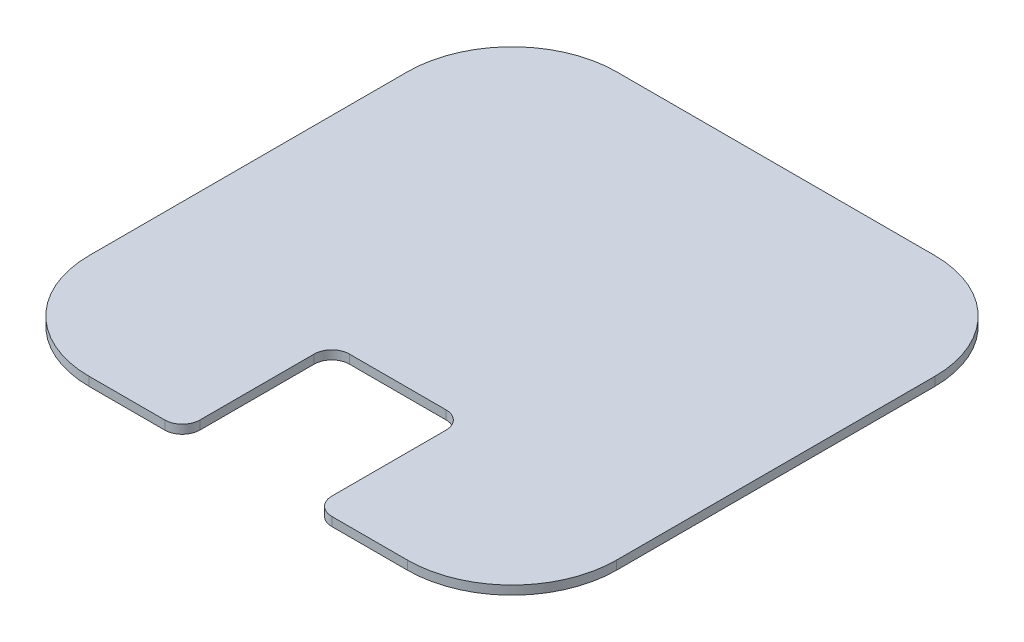
ISO-10303-21;
HEADER;
FILE_DESCRIPTION(('STEP AP214'),'2;1');
FILE_NAME('part.step','',(''),(''),'','','');
FILE_SCHEMA(('AUTOMOTIVE_DESIGN { 1 0 10303 214 1 1 1 1 }'));
ENDSEC;
DATA;
#1=APPLICATION_CONTEXT('core data for automotive mechanical design processes');
#2=APPLICATION_PROTOCOL_DEFINITION('international standard','automotive_design',2000,#1);
#3=PRODUCT_CONTEXT('',#1,'mechanical');
#4=PRODUCT('Part','Part','',(#3));
#5=PRODUCT_RELATED_PRODUCT_CATEGORY('part','',(#4));
#6=PRODUCT_DEFINITION_FORMATION('','',#4);
#7=PRODUCT_DEFINITION_CONTEXT('part definition',#1,'design');
#8=PRODUCT_DEFINITION('design','',#6,#7);
#9=PRODUCT_DEFINITION_SHAPE('','',#8);
#10=(LENGTH_UNIT() NAMED_UNIT(*) SI_UNIT(.MILLI.,.METRE.));
#11=(NAMED_UNIT(*) PLANE_ANGLE_UNIT() SI_UNIT($,.RADIAN.));
#12=(NAMED_UNIT(*) SI_UNIT($,.STERADIAN.) SOLID_ANGLE_UNIT());
#13=UNCERTAINTY_MEASURE_WITH_UNIT(LENGTH_MEASURE(1.E-05),#10,'distance_accuracy_value','');
#14=(GEOMETRIC_REPRESENTATION_CONTEXT(3) GLOBAL_UNCERTAINTY_ASSIGNED_CONTEXT((#13)) GLOBAL_UNIT_ASSIGNED_CONTEXT((#10,
#11,#12)) REPRESENTATION_CONTEXT('',''));
#15=CARTESIAN_POINT('',(0.,0.,0.));
#16=DIRECTION('',(0.,0.,1.));
#17=DIRECTION('',(1.,0.,0.));
#18=AXIS2_PLACEMENT_3D('',#15,#16,#17);
#19=CARTESIAN_POINT('',(-18.1066017177982,1.,30.));
#20=DIRECTION('',(0.,0.,-1.));
#21=DIRECTION('',(-1.,0.,0.));
#22=AXIS2_PLACEMENT_3D('',#19,#20,#21);
#23=PLANE('',#22);
#24=DIRECTION('',(1.,0.,0.));
#25=VECTOR('',#24,1.);
#26=CARTESIAN_POINT('',(-18.1066017177982,0.,30.));
#27=LINE('',#26,#25);
#28=CARTESIAN_POINT('',(-18.1066017177982,0.,30.));
#29=VERTEX_POINT('',#28);
#30=CARTESIAN_POINT('',(-9.5,0.,30.));
#31=VERTEX_POINT('',#30);
#32=EDGE_CURVE('E263',#29,#31,#27,.T.);
#33=ORIENTED_EDGE('',*,*,#32,.T.);
#34=DIRECTION('',(0.,-1.,0.));
#35=VECTOR('',#34,1.);
#36=CARTESIAN_POINT('',(-9.5,1.,30.));
#37=LINE('',#36,#35);
#38=CARTESIAN_POINT('',(-9.5,1.,30.));
#39=VERTEX_POINT('',#38);
#40=EDGE_CURVE('E48',#31,#39,#37,.F.);
#41=ORIENTED_EDGE('',*,*,#40,.T.);
#42=DIRECTION('',(1.,0.,0.));
#43=VECTOR('',#42,1.);
#44=CARTESIAN_POINT('',(-18.1066017177982,1.,30.));
#45=LINE('',#44,#43);
#46=CARTESIAN_POINT('',(-18.1066017177982,1.,30.));
#47=VERTEX_POINT('',#46);
#48=EDGE_CURVE('E249',#47,#39,#45,.T.);
#49=ORIENTED_EDGE('',*,*,#48,.F.);
#50=DIRECTION('',(0.,-1.,0.));
#51=VECTOR('',#50,1.);
#52=CARTESIAN_POINT('',(-18.1066017177982,1.,30.));
#53=LINE('',#52,#51);
#54=EDGE_CURVE('E275',#47,#29,#53,.T.);
#55=ORIENTED_EDGE('',*,*,#54,.T.);
#56=EDGE_LOOP('',(#33,#41,#49,#55));
#57=FACE_BOUND('',#56,.T.);
#58=ADVANCED_FACE('F33',(#57),#23,.F.);
#59=CARTESIAN_POINT('',(9.50000000000001,1.,30.));
#60=VERTEX_POINT('',#59);
#61=CARTESIAN_POINT('',(18.1066017177982,1.,30.));
#62=VERTEX_POINT('',#61);
#63=EDGE_CURVE('E248',#60,#62,#45,.T.);
#64=ORIENTED_EDGE('',*,*,#63,.F.);
#65=DIRECTION('',(0.,-1.,0.));
#66=VECTOR('',#65,1.);
#67=CARTESIAN_POINT('',(9.50000000000001,0.,30.));
#68=LINE('',#67,#66);
#69=CARTESIAN_POINT('',(9.50000000000001,0.,30.));
#70=VERTEX_POINT('',#69);
#71=EDGE_CURVE('E173',#60,#70,#68,.T.);
#72=ORIENTED_EDGE('',*,*,#71,.T.);
#73=CARTESIAN_POINT('',(18.1066017177982,0.,30.));
#74=VERTEX_POINT('',#73);
#75=EDGE_CURVE('E262',#70,#74,#27,.T.);
#76=ORIENTED_EDGE('',*,*,#75,.T.);
#77=DIRECTION('',(0.,-1.,0.));
#78=VECTOR('',#77,1.);
#79=CARTESIAN_POINT('',(18.1066017177982,1.,30.));
#80=LINE('',#79,#78);
#81=EDGE_CURVE('E272',#62,#74,#80,.T.);
#82=ORIENTED_EDGE('',*,*,#81,.F.);
#83=EDGE_LOOP('',(#64,#72,#76,#82));
#84=FACE_BOUND('',#83,.T.);
#85=ADVANCED_FACE('F310',(#84),#23,.F.);
#86=CARTESIAN_POINT('',(18.1066017177982,1.,-18.1066017177982));
#87=DIRECTION('',(0.,-1.,0.));
#88=DIRECTION('',(0.,0.,-1.));
#89=AXIS2_PLACEMENT_3D('',#86,#87,#88);
#90=PLANE('',#89);
#91=DIRECTION('',(0.,0.,-1.));
#92=VECTOR('',#91,1.);
#93=CARTESIAN_POINT('',(7.5,1.,30.));
#94=LINE('',#93,#92);
#95=CARTESIAN_POINT('',(7.5,1.,28.));
#96=VERTEX_POINT('',#95);
#97=CARTESIAN_POINT('',(7.5,1.,15.));
#98=VERTEX_POINT('',#97);
#99=EDGE_CURVE('E231',#96,#98,#94,.T.);
#100=ORIENTED_EDGE('',*,*,#99,.F.);
#101=CARTESIAN_POINT('',(9.50000000000001,1.,28.));
#102=DIRECTION('',(0.,-1.,0.));
#103=DIRECTION('',(0.,0.,-1.));
#104=AXIS2_PLACEMENT_3D('',#101,#102,#103);
#105=CIRCLE('',#104,2.);
#106=EDGE_CURVE('E192',#96,#60,#105,.F.);
#107=ORIENTED_EDGE('',*,*,#106,.T.);
#108=ORIENTED_EDGE('',*,*,#63,.T.);
#109=CARTESIAN_POINT('',(18.1066017177982,1.,18.1066017177982));
#110=DIRECTION('',(0.,1.,0.));
#111=DIRECTION('',(0.,0.,-1.));
#112=AXIS2_PLACEMENT_3D('',#109,#110,#111);
#113=CIRCLE('',#112,11.8933982822018);
#114=CARTESIAN_POINT('',(30.,1.,18.1066017177982));
#115=VERTEX_POINT('',#114);
#116=EDGE_CURVE('E251',#62,#115,#113,.T.);
#117=ORIENTED_EDGE('',*,*,#116,.T.);
#118=DIRECTION('',(0.,0.,-1.));
#119=VECTOR('',#118,1.);
#120=CARTESIAN_POINT('',(30.,1.,18.1066017177982));
#121=LINE('',#120,#119);
#122=CARTESIAN_POINT('',(30.,1.,-18.1066017177982));
#123=VERTEX_POINT('',#122);
#124=EDGE_CURVE('E164',#115,#123,#121,.T.);
#125=ORIENTED_EDGE('',*,*,#124,.T.);
#126=CARTESIAN_POINT('',(18.1066017177982,1.,-18.1066017177982));
#127=DIRECTION('',(0.,1.,0.));
#128=DIRECTION('',(0.,0.,-1.));
#129=AXIS2_PLACEMENT_3D('',#126,#127,#128);
#130=CIRCLE('',#129,11.8933982822018);
#131=CARTESIAN_POINT('',(18.1066017177982,1.,-30.));
#132=VERTEX_POINT('',#131);
#133=EDGE_CURVE('E158',#123,#132,#130,.T.);
#134=ORIENTED_EDGE('',*,*,#133,.T.);
#135=DIRECTION('',(-1.,0.,0.));
#136=VECTOR('',#135,1.);
#137=CARTESIAN_POINT('',(-18.1066017177983,1.,-30.));
#138=LINE('',#137,#136);
#139=CARTESIAN_POINT('',(-18.1066017177983,1.,-30.));
#140=VERTEX_POINT('',#139);
#141=EDGE_CURVE('E148',#132,#140,#138,.T.);
#142=ORIENTED_EDGE('',*,*,#141,.T.);
#143=CARTESIAN_POINT('',(-18.1066017177982,1.,-18.1066017177982));
#144=DIRECTION('',(0.,1.,0.));
#145=DIRECTION('',(0.,0.,-1.));
#146=AXIS2_PLACEMENT_3D('',#143,#144,#145);
#147=CIRCLE('',#146,11.8933982822017);
#148=CARTESIAN_POINT('',(-30.,1.,-18.1066017177982));
#149=VERTEX_POINT('',#148);
#150=EDGE_CURVE('E157',#140,#149,#147,.T.);
#151=ORIENTED_EDGE('',*,*,#150,.T.);
#152=DIRECTION('',(0.,0.,1.));
#153=VECTOR('',#152,1.);
#154=CARTESIAN_POINT('',(-30.,1.,18.1066017177982));
#155=LINE('',#154,#153);
#156=CARTESIAN_POINT('',(-30.,1.,18.1066017177982));
#157=VERTEX_POINT('',#156);
#158=EDGE_CURVE('E244',#149,#157,#155,.T.);
#159=ORIENTED_EDGE('',*,*,#158,.T.);
#160=CARTESIAN_POINT('',(-18.1066017177982,1.,18.1066017177982));
#161=DIRECTION('',(0.,1.,0.));
#162=DIRECTION('',(0.,0.,-1.));
#163=AXIS2_PLACEMENT_3D('',#160,#161,#162);
#164=CIRCLE('',#163,11.8933982822018);
#165=EDGE_CURVE('E246',#157,#47,#164,.T.);
#166=ORIENTED_EDGE('',*,*,#165,.T.);
#167=ORIENTED_EDGE('',*,*,#48,.T.);
#168=CARTESIAN_POINT('',(-9.5,1.,28.));
#169=DIRECTION('',(0.,-1.,0.));
#170=DIRECTION('',(0.,0.,-1.));
#171=AXIS2_PLACEMENT_3D('',#168,#169,#170);
#172=CIRCLE('',#171,2.);
#173=CARTESIAN_POINT('',(-7.5,1.,28.));
#174=VERTEX_POINT('',#173);
#175=EDGE_CURVE('E190',#39,#174,#172,.F.);
#176=ORIENTED_EDGE('',*,*,#175,.T.);
#177=DIRECTION('',(0.,0.,1.));
#178=VECTOR('',#177,1.);
#179=CARTESIAN_POINT('',(-7.5,1.,30.));
#180=LINE('',#179,#178);
#181=CARTESIAN_POINT('',(-7.5,1.,15.));
#182=VERTEX_POINT('',#181);
#183=EDGE_CURVE('E236',#182,#174,#180,.T.);
#184=ORIENTED_EDGE('',*,*,#183,.F.);
#185=CARTESIAN_POINT('',(-5.5,1.,15.));
#186=DIRECTION('',(0.,-1.,0.));
#187=DIRECTION('',(0.,0.,-1.));
#188=AXIS2_PLACEMENT_3D('',#185,#186,#187);
#189=CIRCLE('',#188,2.);
#190=CARTESIAN_POINT('',(-5.5,1.,13.));
#191=VERTEX_POINT('',#190);
#192=EDGE_CURVE('E11',#182,#191,#189,.T.);
#193=ORIENTED_EDGE('',*,*,#192,.T.);
#194=DIRECTION('',(-1.,0.,0.));
#195=VECTOR('',#194,1.);
#196=CARTESIAN_POINT('',(-7.5,1.,13.));
#197=LINE('',#196,#195);
#198=CARTESIAN_POINT('',(5.5,1.,13.));
#199=VERTEX_POINT('',#198);
#200=EDGE_CURVE('E229',#199,#191,#197,.T.);
#201=ORIENTED_EDGE('',*,*,#200,.F.);
#202=CARTESIAN_POINT('',(5.5,1.,15.));
#203=DIRECTION('',(0.,-1.,0.));
#204=DIRECTION('',(0.,0.,-1.));
#205=AXIS2_PLACEMENT_3D('',#202,#203,#204);
#206=CIRCLE('',#205,2.);
#207=EDGE_CURVE('E207',#199,#98,#206,.T.);
#208=ORIENTED_EDGE('',*,*,#207,.T.);
#209=EDGE_LOOP('',(#100,#107,#108,#117,#125,#134,#142,#151,#159,#166,#167,#176,#184,#193,#201,#208));
#210=FACE_BOUND('',#209,.T.);
#211=ADVANCED_FACE('F162',(#210),#90,.F.);
#212=CARTESIAN_POINT('',(18.1066017177982,0.,-18.1066017177982));
#213=DIRECTION('',(0.,-1.,0.));
#214=DIRECTION('',(0.,0.,-1.));
#215=AXIS2_PLACEMENT_3D('',#212,#213,#214);
#216=PLANE('',#215);
#217=ORIENTED_EDGE('',*,*,#75,.F.);
#218=CARTESIAN_POINT('',(9.50000000000001,0.,28.));
#219=DIRECTION('',(0.,-1.,0.));
#220=DIRECTION('',(0.,0.,-1.));
#221=AXIS2_PLACEMENT_3D('',#218,#219,#220);
#222=CIRCLE('',#221,2.);
#223=CARTESIAN_POINT('',(7.5,0.,28.));
#224=VERTEX_POINT('',#223);
#225=EDGE_CURVE('E183',#70,#224,#222,.T.);
#226=ORIENTED_EDGE('',*,*,#225,.T.);
#227=DIRECTION('',(0.,0.,-1.));
#228=VECTOR('',#227,1.);
#229=CARTESIAN_POINT('',(7.5,0.,30.));
#230=LINE('',#229,#228);
#231=CARTESIAN_POINT('',(7.5,0.,15.));
#232=VERTEX_POINT('',#231);
#233=EDGE_CURVE('E224',#224,#232,#230,.T.);
#234=ORIENTED_EDGE('',*,*,#233,.T.);
#235=CARTESIAN_POINT('',(5.5,0.,15.));
#236=DIRECTION('',(0.,-1.,0.));
#237=DIRECTION('',(0.,0.,-1.));
#238=AXIS2_PLACEMENT_3D('',#235,#236,#237);
#239=CIRCLE('',#238,2.);
#240=CARTESIAN_POINT('',(5.5,0.,13.));
#241=VERTEX_POINT('',#240);
#242=EDGE_CURVE('E205',#232,#241,#239,.F.);
#243=ORIENTED_EDGE('',*,*,#242,.T.);
#244=DIRECTION('',(-1.,0.,0.));
#245=VECTOR('',#244,1.);
#246=CARTESIAN_POINT('',(-7.5,0.,13.));
#247=LINE('',#246,#245);
#248=CARTESIAN_POINT('',(-5.5,0.,13.));
#249=VERTEX_POINT('',#248);
#250=EDGE_CURVE('E216',#241,#249,#247,.T.);
#251=ORIENTED_EDGE('',*,*,#250,.T.);
#252=CARTESIAN_POINT('',(-5.5,0.,15.));
#253=DIRECTION('',(0.,-1.,0.));
#254=DIRECTION('',(0.,0.,-1.));
#255=AXIS2_PLACEMENT_3D('',#252,#253,#254);
#256=CIRCLE('',#255,2.);
#257=CARTESIAN_POINT('',(-7.5,0.,15.));
#258=VERTEX_POINT('',#257);
#259=EDGE_CURVE('E41',#249,#258,#256,.F.);
#260=ORIENTED_EDGE('',*,*,#259,.T.);
#261=DIRECTION('',(0.,0.,1.));
#262=VECTOR('',#261,1.);
#263=CARTESIAN_POINT('',(-7.5,0.,30.));
#264=LINE('',#263,#262);
#265=CARTESIAN_POINT('',(-7.5,0.,28.));
#266=VERTEX_POINT('',#265);
#267=EDGE_CURVE('E214',#258,#266,#264,.T.);
#268=ORIENTED_EDGE('',*,*,#267,.T.);
#269=CARTESIAN_POINT('',(-9.5,0.,28.));
#270=DIRECTION('',(0.,-1.,0.));
#271=DIRECTION('',(0.,0.,-1.));
#272=AXIS2_PLACEMENT_3D('',#269,#270,#271);
#273=CIRCLE('',#272,2.);
#274=EDGE_CURVE('E176',#266,#31,#273,.T.);
#275=ORIENTED_EDGE('',*,*,#274,.T.);
#276=ORIENTED_EDGE('',*,*,#32,.F.);
#277=CARTESIAN_POINT('',(-18.1066017177982,0.,18.1066017177982));
#278=DIRECTION('',(0.,1.,0.));
#279=DIRECTION('',(0.,0.,-1.));
#280=AXIS2_PLACEMENT_3D('',#277,#278,#279);
#281=CIRCLE('',#280,11.8933982822018);
#282=CARTESIAN_POINT('',(-30.,0.,18.1066017177982));
#283=VERTEX_POINT('',#282);
#284=EDGE_CURVE('E260',#283,#29,#281,.T.);
#285=ORIENTED_EDGE('',*,*,#284,.F.);
#286=DIRECTION('',(0.,0.,1.));
#287=VECTOR('',#286,1.);
#288=CARTESIAN_POINT('',(-30.,0.,18.1066017177982));
#289=LINE('',#288,#287);
#290=CARTESIAN_POINT('',(-30.,0.,-18.1066017177982));
#291=VERTEX_POINT('',#290);
#292=EDGE_CURVE('E258',#291,#283,#289,.T.);
#293=ORIENTED_EDGE('',*,*,#292,.F.);
#294=CARTESIAN_POINT('',(-18.1066017177982,0.,-18.1066017177982));
#295=DIRECTION('',(0.,1.,0.));
#296=DIRECTION('',(0.,0.,-1.));
#297=AXIS2_PLACEMENT_3D('',#294,#295,#296);
#298=CIRCLE('',#297,11.8933982822017);
#299=CARTESIAN_POINT('',(-18.1066017177983,0.,-30.));
#300=VERTEX_POINT('',#299);
#301=EDGE_CURVE('E256',#300,#291,#298,.T.);
#302=ORIENTED_EDGE('',*,*,#301,.F.);
#303=DIRECTION('',(-1.,0.,0.));
#304=VECTOR('',#303,1.);
#305=CARTESIAN_POINT('',(-18.1066017177983,0.,-30.));
#306=LINE('',#305,#304);
#307=CARTESIAN_POINT('',(18.1066017177982,0.,-30.));
#308=VERTEX_POINT('',#307);
#309=EDGE_CURVE('E233',#308,#300,#306,.T.);
#310=ORIENTED_EDGE('',*,*,#309,.F.);
#311=CARTESIAN_POINT('',(18.1066017177982,0.,-18.1066017177982));
#312=DIRECTION('',(0.,1.,0.));
#313=DIRECTION('',(0.,0.,-1.));
#314=AXIS2_PLACEMENT_3D('',#311,#312,#313);
#315=CIRCLE('',#314,11.8933982822018);
#316=CARTESIAN_POINT('',(30.,0.,-18.1066017177982));
#317=VERTEX_POINT('',#316);
#318=EDGE_CURVE('E172',#317,#308,#315,.T.);
#319=ORIENTED_EDGE('',*,*,#318,.F.);
#320=DIRECTION('',(0.,0.,-1.));
#321=VECTOR('',#320,1.);
#322=CARTESIAN_POINT('',(30.,0.,18.1066017177982));
#323=LINE('',#322,#321);
#324=CARTESIAN_POINT('',(30.,0.,18.1066017177982));
#325=VERTEX_POINT('',#324);
#326=EDGE_CURVE('E168',#325,#317,#323,.T.);
#327=ORIENTED_EDGE('',*,*,#326,.F.);
#328=CARTESIAN_POINT('',(18.1066017177982,0.,18.1066017177982));
#329=DIRECTION('',(0.,1.,0.));
#330=DIRECTION('',(0.,0.,-1.));
#331=AXIS2_PLACEMENT_3D('',#328,#329,#330);
#332=CIRCLE('',#331,11.8933982822018);
#333=EDGE_CURVE('E265',#74,#325,#332,.T.);
#334=ORIENTED_EDGE('',*,*,#333,.F.);
#335=EDGE_LOOP('',(#217,#226,#234,#243,#251,#260,#268,#275,#276,#285,#293,#302,#310,#319,#327,#334));
#336=FACE_BOUND('',#335,.T.);
#337=ADVANCED_FACE('F213',(#336),#216,.T.);
#338=CARTESIAN_POINT('',(18.1066017177982,1.,-18.1066017177982));
#339=DIRECTION('',(0.,-1.,0.));
#340=DIRECTION('',(0.,0.,-1.));
#341=AXIS2_PLACEMENT_3D('',#338,#339,#340);
#342=CYLINDRICAL_SURFACE('',#341,11.8933982822018);
#343=ORIENTED_EDGE('',*,*,#318,.T.);
#344=DIRECTION('',(0.,-1.,0.));
#345=VECTOR('',#344,1.);
#346=CARTESIAN_POINT('',(18.1066017177982,1.,-30.));
#347=LINE('',#346,#345);
#348=EDGE_CURVE('E152',#132,#308,#347,.T.);
#349=ORIENTED_EDGE('',*,*,#348,.F.);
#350=ORIENTED_EDGE('',*,*,#133,.F.);
#351=DIRECTION('',(0.,-1.,0.));
#352=VECTOR('',#351,1.);
#353=CARTESIAN_POINT('',(30.,1.,-18.1066017177982));
#354=LINE('',#353,#352);
#355=EDGE_CURVE('E253',#123,#317,#354,.T.);
#356=ORIENTED_EDGE('',*,*,#355,.T.);
#357=EDGE_LOOP('',(#343,#349,#350,#356));
#358=FACE_BOUND('',#357,.T.);
#359=ADVANCED_FACE('F170',(#358),#342,.T.);
#360=CARTESIAN_POINT('',(-18.1066017177983,1.,-30.));
#361=DIRECTION('',(0.,0.,1.));
#362=DIRECTION('',(1.,0.,0.));
#363=AXIS2_PLACEMENT_3D('',#360,#361,#362);
#364=PLANE('',#363);
#365=ORIENTED_EDGE('',*,*,#309,.T.);
#366=DIRECTION('',(0.,-1.,0.));
#367=VECTOR('',#366,1.);
#368=CARTESIAN_POINT('',(-18.1066017177983,1.,-30.));
#369=LINE('',#368,#367);
#370=EDGE_CURVE('E155',#140,#300,#369,.T.);
#371=ORIENTED_EDGE('',*,*,#370,.F.);
#372=ORIENTED_EDGE('',*,*,#141,.F.);
#373=ORIENTED_EDGE('',*,*,#348,.T.);
#374=EDGE_LOOP('',(#365,#371,#372,#373));
#375=FACE_BOUND('',#374,.T.);
#376=ADVANCED_FACE('F150',(#375),#364,.F.);
#377=CARTESIAN_POINT('',(-18.1066017177982,1.,-18.1066017177982));
#378=DIRECTION('',(0.,-1.,0.));
#379=DIRECTION('',(0.,0.,-1.));
#380=AXIS2_PLACEMENT_3D('',#377,#378,#379);
#381=CYLINDRICAL_SURFACE('',#380,11.8933982822017);
#382=ORIENTED_EDGE('',*,*,#301,.T.);
#383=DIRECTION('',(0.,-1.,0.));
#384=VECTOR('',#383,1.);
#385=CARTESIAN_POINT('',(-30.,1.,-18.1066017177982));
#386=LINE('',#385,#384);
#387=EDGE_CURVE('E178',#149,#291,#386,.T.);
#388=ORIENTED_EDGE('',*,*,#387,.F.);
#389=ORIENTED_EDGE('',*,*,#150,.F.);
#390=ORIENTED_EDGE('',*,*,#370,.T.);
#391=EDGE_LOOP('',(#382,#388,#389,#390));
#392=FACE_BOUND('',#391,.T.);
#393=ADVANCED_FACE('F325',(#392),#381,.T.);
#394=CARTESIAN_POINT('',(-30.,1.,18.1066017177982));
#395=DIRECTION('',(1.,0.,0.));
#396=DIRECTION('',(0.,0.,-1.));
#397=AXIS2_PLACEMENT_3D('',#394,#395,#396);
#398=PLANE('',#397);
#399=ORIENTED_EDGE('',*,*,#292,.T.);
#400=DIRECTION('',(0.,-1.,0.));
#401=VECTOR('',#400,1.);
#402=CARTESIAN_POINT('',(-30.,1.,18.1066017177982));
#403=LINE('',#402,#401);
#404=EDGE_CURVE('E278',#157,#283,#403,.T.);
#405=ORIENTED_EDGE('',*,*,#404,.F.);
#406=ORIENTED_EDGE('',*,*,#158,.F.);
#407=ORIENTED_EDGE('',*,*,#387,.T.);
#408=EDGE_LOOP('',(#399,#405,#406,#407));
#409=FACE_BOUND('',#408,.T.);
#410=ADVANCED_FACE('F285',(#409),#398,.F.);
#411=CARTESIAN_POINT('',(-18.1066017177982,1.,18.1066017177982));
#412=DIRECTION('',(0.,-1.,0.));
#413=DIRECTION('',(0.,0.,-1.));
#414=AXIS2_PLACEMENT_3D('',#411,#412,#413);
#415=CYLINDRICAL_SURFACE('',#414,11.8933982822018);
#416=ORIENTED_EDGE('',*,*,#284,.T.);
#417=ORIENTED_EDGE('',*,*,#54,.F.);
#418=ORIENTED_EDGE('',*,*,#165,.F.);
#419=ORIENTED_EDGE('',*,*,#404,.T.);
#420=EDGE_LOOP('',(#416,#417,#418,#419));
#421=FACE_BOUND('',#420,.T.);
#422=ADVANCED_FACE('F293',(#421),#415,.T.);
#423=CARTESIAN_POINT('',(18.1066017177982,1.,18.1066017177982));
#424=DIRECTION('',(0.,-1.,0.));
#425=DIRECTION('',(0.,0.,-1.));
#426=AXIS2_PLACEMENT_3D('',#423,#424,#425);
#427=CYLINDRICAL_SURFACE('',#426,11.8933982822018);
#428=ORIENTED_EDGE('',*,*,#333,.T.);
#429=DIRECTION('',(0.,-1.,0.));
#430=VECTOR('',#429,1.);
#431=CARTESIAN_POINT('',(30.,1.,18.1066017177982));
#432=LINE('',#431,#430);
#433=EDGE_CURVE('E269',#115,#325,#432,.T.);
#434=ORIENTED_EDGE('',*,*,#433,.F.);
#435=ORIENTED_EDGE('',*,*,#116,.F.);
#436=ORIENTED_EDGE('',*,*,#81,.T.);
#437=EDGE_LOOP('',(#428,#434,#435,#436));
#438=FACE_BOUND('',#437,.T.);
#439=ADVANCED_FACE('F319',(#438),#427,.T.);
#440=CARTESIAN_POINT('',(30.,1.,18.1066017177982));
#441=DIRECTION('',(-1.,0.,0.));
#442=DIRECTION('',(0.,0.,1.));
#443=AXIS2_PLACEMENT_3D('',#440,#441,#442);
#444=PLANE('',#443);
#445=ORIENTED_EDGE('',*,*,#326,.T.);
#446=ORIENTED_EDGE('',*,*,#355,.F.);
#447=ORIENTED_EDGE('',*,*,#124,.F.);
#448=ORIENTED_EDGE('',*,*,#433,.T.);
#449=EDGE_LOOP('',(#445,#446,#447,#448));
#450=FACE_BOUND('',#449,.T.);
#451=ADVANCED_FACE('F341',(#450),#444,.F.);
#452=CARTESIAN_POINT('',(-7.5,1.,30.));
#453=DIRECTION('',(1.,0.,0.));
#454=DIRECTION('',(0.,0.,-1.));
#455=AXIS2_PLACEMENT_3D('',#452,#453,#454);
#456=PLANE('',#455);
#457=ORIENTED_EDGE('',*,*,#183,.T.);
#458=DIRECTION('',(0.,-1.,0.));
#459=VECTOR('',#458,1.);
#460=CARTESIAN_POINT('',(-7.5,0.,28.));
#461=LINE('',#460,#459);
#462=EDGE_CURVE('E196',#174,#266,#461,.T.);
#463=ORIENTED_EDGE('',*,*,#462,.T.);
#464=ORIENTED_EDGE('',*,*,#267,.F.);
#465=DIRECTION('',(0.,-1.,0.));
#466=VECTOR('',#465,1.);
#467=CARTESIAN_POINT('',(-7.5,1.,15.));
#468=LINE('',#467,#466);
#469=EDGE_CURVE('E194',#258,#182,#468,.F.);
#470=ORIENTED_EDGE('',*,*,#469,.T.);
#471=EDGE_LOOP('',(#457,#463,#464,#470));
#472=FACE_BOUND('',#471,.T.);
#473=ADVANCED_FACE('F222',(#472),#456,.T.);
#474=CARTESIAN_POINT('',(7.5,1.,30.));
#475=DIRECTION('',(-1.,0.,0.));
#476=DIRECTION('',(0.,0.,1.));
#477=AXIS2_PLACEMENT_3D('',#474,#475,#476);
#478=PLANE('',#477);
#479=ORIENTED_EDGE('',*,*,#233,.F.);
#480=DIRECTION('',(0.,-1.,0.));
#481=VECTOR('',#480,1.);
#482=CARTESIAN_POINT('',(7.5,1.,28.));
#483=LINE('',#482,#481);
#484=EDGE_CURVE('E188',#224,#96,#483,.F.);
#485=ORIENTED_EDGE('',*,*,#484,.T.);
#486=ORIENTED_EDGE('',*,*,#99,.T.);
#487=DIRECTION('',(0.,-1.,0.));
#488=VECTOR('',#487,1.);
#489=CARTESIAN_POINT('',(7.5,0.,15.));
#490=LINE('',#489,#488);
#491=EDGE_CURVE('E185',#98,#232,#490,.T.);
#492=ORIENTED_EDGE('',*,*,#491,.T.);
#493=EDGE_LOOP('',(#479,#485,#486,#492));
#494=FACE_BOUND('',#493,.T.);
#495=ADVANCED_FACE('F348',(#494),#478,.T.);
#496=CARTESIAN_POINT('',(-7.5,1.,13.));
#497=DIRECTION('',(0.,0.,1.));
#498=DIRECTION('',(1.,0.,0.));
#499=AXIS2_PLACEMENT_3D('',#496,#497,#498);
#500=PLANE('',#499);
#501=ORIENTED_EDGE('',*,*,#250,.F.);
#502=DIRECTION('',(0.,-1.,0.));
#503=VECTOR('',#502,1.);
#504=CARTESIAN_POINT('',(5.5,1.,13.));
#505=LINE('',#504,#503);
#506=EDGE_CURVE('E203',#241,#199,#505,.F.);
#507=ORIENTED_EDGE('',*,*,#506,.T.);
#508=ORIENTED_EDGE('',*,*,#200,.T.);
#509=DIRECTION('',(0.,-1.,0.));
#510=VECTOR('',#509,1.);
#511=CARTESIAN_POINT('',(-5.5,0.,13.));
#512=LINE('',#511,#510);
#513=EDGE_CURVE('E200',#191,#249,#512,.T.);
#514=ORIENTED_EDGE('',*,*,#513,.T.);
#515=EDGE_LOOP('',(#501,#507,#508,#514));
#516=FACE_BOUND('',#515,.T.);
#517=ADVANCED_FACE('F227',(#516),#500,.T.);
#518=CARTESIAN_POINT('',(9.50000000000001,1.,28.));
#519=DIRECTION('',(0.,1.,0.));
#520=DIRECTION('',(0.,0.,1.));
#521=AXIS2_PLACEMENT_3D('',#518,#519,#520);
#522=CYLINDRICAL_SURFACE('',#521,2.);
#523=ORIENTED_EDGE('',*,*,#106,.F.);
#524=ORIENTED_EDGE('',*,*,#484,.F.);
#525=ORIENTED_EDGE('',*,*,#225,.F.);
#526=ORIENTED_EDGE('',*,*,#71,.F.);
#527=EDGE_LOOP('',(#523,#524,#525,#526));
#528=FACE_BOUND('',#527,.T.);
#529=ADVANCED_FACE('F300',(#528),#522,.T.);
#530=CARTESIAN_POINT('',(-9.5,1.,28.));
#531=DIRECTION('',(0.,1.,0.));
#532=DIRECTION('',(0.,0.,1.));
#533=AXIS2_PLACEMENT_3D('',#530,#531,#532);
#534=CYLINDRICAL_SURFACE('',#533,2.);
#535=ORIENTED_EDGE('',*,*,#175,.F.);
#536=ORIENTED_EDGE('',*,*,#40,.F.);
#537=ORIENTED_EDGE('',*,*,#274,.F.);
#538=ORIENTED_EDGE('',*,*,#462,.F.);
#539=EDGE_LOOP('',(#535,#536,#537,#538));
#540=FACE_BOUND('',#539,.T.);
#541=ADVANCED_FACE('F297',(#540),#534,.T.);
#542=CARTESIAN_POINT('',(5.5,1.,15.));
#543=DIRECTION('',(0.,1.,0.));
#544=DIRECTION('',(0.,0.,1.));
#545=AXIS2_PLACEMENT_3D('',#542,#543,#544);
#546=CYLINDRICAL_SURFACE('',#545,2.);
#547=ORIENTED_EDGE('',*,*,#207,.F.);
#548=ORIENTED_EDGE('',*,*,#506,.F.);
#549=ORIENTED_EDGE('',*,*,#242,.F.);
#550=ORIENTED_EDGE('',*,*,#491,.F.);
#551=EDGE_LOOP('',(#547,#548,#549,#550));
#552=FACE_BOUND('',#551,.T.);
#553=ADVANCED_FACE('F299',(#552),#546,.F.);
#554=CARTESIAN_POINT('',(-5.5,1.,15.));
#555=DIRECTION('',(0.,1.,0.));
#556=DIRECTION('',(0.,0.,1.));
#557=AXIS2_PLACEMENT_3D('',#554,#555,#556);
#558=CYLINDRICAL_SURFACE('',#557,2.);
#559=ORIENTED_EDGE('',*,*,#192,.F.);
#560=ORIENTED_EDGE('',*,*,#469,.F.);
#561=ORIENTED_EDGE('',*,*,#259,.F.);
#562=ORIENTED_EDGE('',*,*,#513,.F.);
#563=EDGE_LOOP('',(#559,#560,#561,#562));
#564=FACE_BOUND('',#563,.T.);
#565=ADVANCED_FACE('F35',(#564),#558,.F.);
#566=CLOSED_SHELL('',(#58,#85,#211,#337,#359,#376,#393,#410,#422,#439,#451,#473,#495,#517,#529,
#541,#553,#565));
#567=MANIFOLD_SOLID_BREP('B2',#566);
#568=ADVANCED_BREP_SHAPE_REPRESENTATION('',(#18,#567),#14);
#569=SHAPE_DEFINITION_REPRESENTATION(#9,#568);
ENDSEC;
END-ISO-10303-21;
